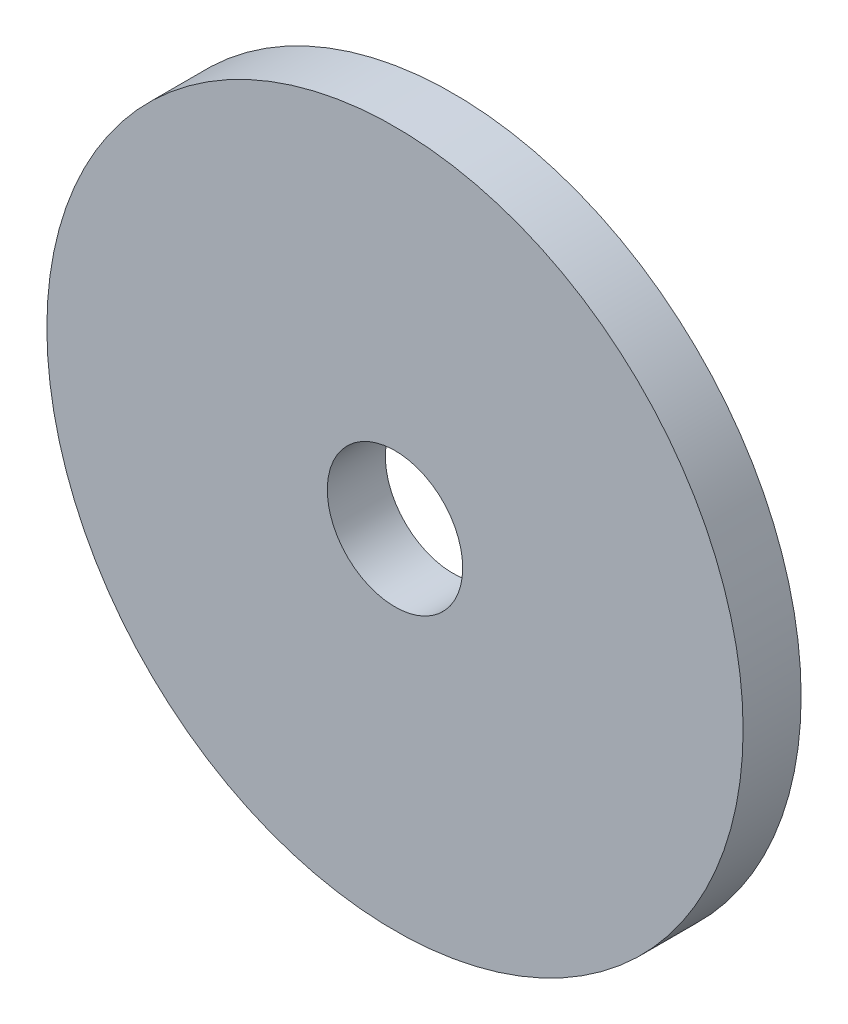
ISO-10303-21;
HEADER;
FILE_DESCRIPTION(('STEP AP214'),'2;1');
FILE_NAME('part.step','',(''),(''),'','','');
FILE_SCHEMA(('AUTOMOTIVE_DESIGN { 1 0 10303 214 1 1 1 1 }'));
ENDSEC;
DATA;
#1=APPLICATION_CONTEXT('core data for automotive mechanical design processes');
#2=APPLICATION_PROTOCOL_DEFINITION('international standard','automotive_design',2000,#1);
#3=PRODUCT_CONTEXT('',#1,'mechanical');
#4=PRODUCT('Part','Part','',(#3));
#5=PRODUCT_RELATED_PRODUCT_CATEGORY('part','',(#4));
#6=PRODUCT_DEFINITION_FORMATION('','',#4);
#7=PRODUCT_DEFINITION_CONTEXT('part definition',#1,'design');
#8=PRODUCT_DEFINITION('design','',#6,#7);
#9=PRODUCT_DEFINITION_SHAPE('','',#8);
#10=(LENGTH_UNIT() NAMED_UNIT(*) SI_UNIT(.MILLI.,.METRE.));
#11=(NAMED_UNIT(*) PLANE_ANGLE_UNIT() SI_UNIT($,.RADIAN.));
#12=(NAMED_UNIT(*) SI_UNIT($,.STERADIAN.) SOLID_ANGLE_UNIT());
#13=UNCERTAINTY_MEASURE_WITH_UNIT(LENGTH_MEASURE(1.E-05),#10,'distance_accuracy_value','');
#14=(GEOMETRIC_REPRESENTATION_CONTEXT(3) GLOBAL_UNCERTAINTY_ASSIGNED_CONTEXT((#13)) GLOBAL_UNIT_ASSIGNED_CONTEXT((#10,
#11,#12)) REPRESENTATION_CONTEXT('',''));
#15=CARTESIAN_POINT('',(0.,0.,0.));
#16=DIRECTION('',(0.,0.,1.));
#17=DIRECTION('',(1.,0.,0.));
#18=AXIS2_PLACEMENT_3D('',#15,#16,#17);
#19=CARTESIAN_POINT('',(0.,0.,38.1));
#20=DIRECTION('',(0.,0.,-1.));
#21=DIRECTION('',(-1.,0.,0.));
#22=AXIS2_PLACEMENT_3D('',#19,#20,#21);
#23=CYLINDRICAL_SURFACE('',#22,228.6);
#24=CARTESIAN_POINT('',(0.,0.,38.1));
#25=DIRECTION('',(0.,0.,1.));
#26=DIRECTION('',(1.,0.,0.));
#27=AXIS2_PLACEMENT_3D('',#24,#25,#26);
#28=CIRCLE('',#27,228.6);
#29=CARTESIAN_POINT('',(-228.6,0.,38.1));
#30=VERTEX_POINT('',#29);
#31=EDGE_CURVE('E10',#30,#30,#28,.T.);
#32=CARTESIAN_POINT('',(0.,0.,0.));
#33=DIRECTION('',(0.,0.,1.));
#34=DIRECTION('',(1.,0.,0.));
#35=AXIS2_PLACEMENT_3D('',#32,#33,#34);
#36=CIRCLE('',#35,228.6);
#37=CARTESIAN_POINT('',(-228.6,0.,0.));
#38=VERTEX_POINT('',#37);
#39=EDGE_CURVE('E34',#38,#38,#36,.T.);
#40=CARTESIAN_POINT('',(-228.6,0.,38.1));
#41=CARTESIAN_POINT('',(-228.6,0.,37.703125));
#42=CARTESIAN_POINT('',(-228.6,0.,37.30625));
#43=CARTESIAN_POINT('',(-228.6,0.,36.5125));
#44=CARTESIAN_POINT('',(-228.6,0.,36.115625));
#45=CARTESIAN_POINT('',(-228.6,0.,35.321875));
#46=CARTESIAN_POINT('',(-228.6,0.,34.925));
#47=CARTESIAN_POINT('',(-228.6,0.,34.13125));
#48=CARTESIAN_POINT('',(-228.6,0.,33.734375));
#49=CARTESIAN_POINT('',(-228.6,0.,32.940625));
#50=CARTESIAN_POINT('',(-228.6,0.,32.54375));
#51=CARTESIAN_POINT('',(-228.6,0.,31.75));
#52=CARTESIAN_POINT('',(-228.6,0.,31.353125));
#53=CARTESIAN_POINT('',(-228.6,0.,30.559375));
#54=CARTESIAN_POINT('',(-228.6,0.,30.1625));
#55=CARTESIAN_POINT('',(-228.6,0.,29.36875));
#56=CARTESIAN_POINT('',(-228.6,0.,28.971875));
#57=CARTESIAN_POINT('',(-228.6,0.,28.178125));
#58=CARTESIAN_POINT('',(-228.6,0.,27.78125));
#59=CARTESIAN_POINT('',(-228.6,0.,26.9875));
#60=CARTESIAN_POINT('',(-228.6,0.,26.590625));
#61=CARTESIAN_POINT('',(-228.6,0.,25.796875));
#62=CARTESIAN_POINT('',(-228.6,0.,25.4));
#63=CARTESIAN_POINT('',(-228.6,0.,24.60625));
#64=CARTESIAN_POINT('',(-228.6,0.,24.209375));
#65=CARTESIAN_POINT('',(-228.6,0.,23.415625));
#66=CARTESIAN_POINT('',(-228.6,0.,23.01875));
#67=CARTESIAN_POINT('',(-228.6,0.,22.225));
#68=CARTESIAN_POINT('',(-228.6,0.,21.828125));
#69=CARTESIAN_POINT('',(-228.6,0.,21.034375));
#70=CARTESIAN_POINT('',(-228.6,0.,20.6375));
#71=CARTESIAN_POINT('',(-228.6,0.,19.84375));
#72=CARTESIAN_POINT('',(-228.6,0.,19.446875));
#73=CARTESIAN_POINT('',(-228.6,0.,18.653125));
#74=CARTESIAN_POINT('',(-228.6,0.,18.25625));
#75=CARTESIAN_POINT('',(-228.6,0.,17.4625));
#76=CARTESIAN_POINT('',(-228.6,0.,17.065625));
#77=CARTESIAN_POINT('',(-228.6,0.,16.271875));
#78=CARTESIAN_POINT('',(-228.6,0.,15.875));
#79=CARTESIAN_POINT('',(-228.6,0.,15.08125));
#80=CARTESIAN_POINT('',(-228.6,0.,14.684375));
#81=CARTESIAN_POINT('',(-228.6,0.,13.890625));
#82=CARTESIAN_POINT('',(-228.6,0.,13.49375));
#83=CARTESIAN_POINT('',(-228.6,0.,12.7));
#84=CARTESIAN_POINT('',(-228.6,0.,12.303125));
#85=CARTESIAN_POINT('',(-228.6,0.,11.509375));
#86=CARTESIAN_POINT('',(-228.6,0.,11.1125));
#87=CARTESIAN_POINT('',(-228.6,0.,10.31875));
#88=CARTESIAN_POINT('',(-228.6,0.,9.92187499999999));
#89=CARTESIAN_POINT('',(-228.6,0.,9.128125));
#90=CARTESIAN_POINT('',(-228.6,0.,8.73124999999999));
#91=CARTESIAN_POINT('',(-228.6,0.,7.93749999999999));
#92=CARTESIAN_POINT('',(-228.6,0.,7.54062499999999));
#93=CARTESIAN_POINT('',(-228.6,0.,6.746875));
#94=CARTESIAN_POINT('',(-228.6,0.,6.35));
#95=CARTESIAN_POINT('',(-228.6,0.,5.55625));
#96=CARTESIAN_POINT('',(-228.6,0.,5.159375));
#97=CARTESIAN_POINT('',(-228.6,0.,4.365625));
#98=CARTESIAN_POINT('',(-228.6,0.,3.96875));
#99=CARTESIAN_POINT('',(-228.6,0.,3.175));
#100=CARTESIAN_POINT('',(-228.6,0.,2.778125));
#101=CARTESIAN_POINT('',(-228.6,0.,1.984375));
#102=CARTESIAN_POINT('',(-228.6,0.,1.5875));
#103=CARTESIAN_POINT('',(-228.6,0.,0.79375));
#104=CARTESIAN_POINT('',(-228.6,0.,0.396875));
#105=CARTESIAN_POINT('',(-228.6,0.,0.));
#106=B_SPLINE_CURVE_WITH_KNOTS('',3,(#40,#41,#42,#43,#44,#45,#46,#47,#48,#49,#50,#51,#52,#53,
#54,#55,#56,#57,#58,#59,#60,#61,#62,#63,#64,#65,#66,#67,#68,#69,#70,#71,#72,#73,#74,#75,#76,#77,
#78,#79,#80,#81,#82,#83,#84,#85,#86,#87,#88,#89,#90,#91,#92,#93,#94,#95,#96,#97,#98,#99,#100,
#101,#102,#103,#104,#105),.UNSPECIFIED.,.F.,.F.,(4,2,2,2,2,2,2,2,2,2,2,2,2,2,2,2,2,2,2,2,2,2,2,
2,2,2,2,2,2,2,2,2,4),(0.,1.190625,2.38125,3.571875,4.7625,5.953125,7.14375,8.334375,
9.52500000000001,10.715625,11.90625,13.096875,14.2875,15.478125,16.66875,17.859375,19.05,
20.240625,21.43125,22.621875,23.8125,25.003125,26.19375,27.384375,28.575,29.765625,30.95625,
32.146875,33.3375,34.528125,35.71875,36.909375,38.1),.UNSPECIFIED.);
#107=EDGE_CURVE('BSEAM31',#30,#38,#106,.T.);
#108=ORIENTED_EDGE('',*,*,#31,.F.);
#109=ORIENTED_EDGE('',*,*,#39,.T.);
#110=ORIENTED_EDGE('',*,*,#107,.T.);
#111=ORIENTED_EDGE('',*,*,#107,.F.);
#112=EDGE_LOOP('',(#108,#110,#109,#111));
#113=FACE_BOUND('',#112,.T.);
#114=ADVANCED_FACE('F31',(#113),#23,.T.);
#115=CARTESIAN_POINT('',(0.,0.,38.1));
#116=DIRECTION('',(0.,0.,1.));
#117=DIRECTION('',(1.,0.,0.));
#118=AXIS2_PLACEMENT_3D('',#115,#116,#117);
#119=PLANE('',#118);
#120=CARTESIAN_POINT('',(0.,0.,38.1));
#121=DIRECTION('',(0.,0.,1.));
#122=DIRECTION('',(1.,0.,0.));
#123=AXIS2_PLACEMENT_3D('',#120,#121,#122);
#124=CIRCLE('',#123,44.45);
#125=CARTESIAN_POINT('',(44.45,0.,38.1));
#126=VERTEX_POINT('',#125);
#127=EDGE_CURVE('E43',#126,#126,#124,.T.);
#128=ORIENTED_EDGE('',*,*,#127,.F.);
#129=EDGE_LOOP('',(#128));
#130=FACE_BOUND('',#129,.T.);
#131=ORIENTED_EDGE('',*,*,#31,.T.);
#132=EDGE_LOOP('',(#131));
#133=FACE_BOUND('',#132,.T.);
#134=ADVANCED_FACE('F58',(#130,#133),#119,.T.);
#135=CARTESIAN_POINT('',(0.,0.,0.));
#136=DIRECTION('',(0.,0.,1.));
#137=DIRECTION('',(1.,0.,0.));
#138=AXIS2_PLACEMENT_3D('',#135,#136,#137);
#139=PLANE('',#138);
#140=CARTESIAN_POINT('',(0.,0.,0.));
#141=DIRECTION('',(0.,0.,1.));
#142=DIRECTION('',(1.,0.,0.));
#143=AXIS2_PLACEMENT_3D('',#140,#141,#142);
#144=CIRCLE('',#143,44.45);
#145=CARTESIAN_POINT('',(44.45,0.,0.));
#146=VERTEX_POINT('',#145);
#147=EDGE_CURVE('E41',#146,#146,#144,.T.);
#148=ORIENTED_EDGE('',*,*,#147,.T.);
#149=EDGE_LOOP('',(#148));
#150=FACE_BOUND('',#149,.T.);
#151=ORIENTED_EDGE('',*,*,#39,.F.);
#152=EDGE_LOOP('',(#151));
#153=FACE_BOUND('',#152,.T.);
#154=ADVANCED_FACE('F49',(#150,#153),#139,.F.);
#155=CARTESIAN_POINT('',(0.,0.,0.));
#156=DIRECTION('',(0.,0.,1.));
#157=DIRECTION('',(1.,0.,0.));
#158=AXIS2_PLACEMENT_3D('',#155,#156,#157);
#159=CYLINDRICAL_SURFACE('',#158,44.45);
#160=CARTESIAN_POINT('',(44.45,0.,0.));
#161=CARTESIAN_POINT('',(44.45,0.,0.396875));
#162=CARTESIAN_POINT('',(44.45,0.,0.79375));
#163=CARTESIAN_POINT('',(44.45,0.,1.5875));
#164=CARTESIAN_POINT('',(44.45,0.,1.984375));
#165=CARTESIAN_POINT('',(44.45,0.,2.778125));
#166=CARTESIAN_POINT('',(44.45,0.,3.175));
#167=CARTESIAN_POINT('',(44.45,0.,3.96875));
#168=CARTESIAN_POINT('',(44.45,0.,4.365625));
#169=CARTESIAN_POINT('',(44.45,0.,5.159375));
#170=CARTESIAN_POINT('',(44.45,0.,5.55625));
#171=CARTESIAN_POINT('',(44.45,0.,6.35));
#172=CARTESIAN_POINT('',(44.45,0.,6.746875));
#173=CARTESIAN_POINT('',(44.45,0.,7.540625));
#174=CARTESIAN_POINT('',(44.45,0.,7.9375));
#175=CARTESIAN_POINT('',(44.45,0.,8.73125));
#176=CARTESIAN_POINT('',(44.45,0.,9.128125));
#177=CARTESIAN_POINT('',(44.45,0.,9.921875));
#178=CARTESIAN_POINT('',(44.45,0.,10.31875));
#179=CARTESIAN_POINT('',(44.45,0.,11.1125));
#180=CARTESIAN_POINT('',(44.45,0.,11.509375));
#181=CARTESIAN_POINT('',(44.45,0.,12.303125));
#182=CARTESIAN_POINT('',(44.45,0.,12.7));
#183=CARTESIAN_POINT('',(44.45,0.,13.49375));
#184=CARTESIAN_POINT('',(44.45,0.,13.890625));
#185=CARTESIAN_POINT('',(44.45,0.,14.684375));
#186=CARTESIAN_POINT('',(44.45,0.,15.08125));
#187=CARTESIAN_POINT('',(44.45,0.,15.875));
#188=CARTESIAN_POINT('',(44.45,0.,16.271875));
#189=CARTESIAN_POINT('',(44.45,0.,17.065625));
#190=CARTESIAN_POINT('',(44.45,0.,17.4625));
#191=CARTESIAN_POINT('',(44.45,0.,18.25625));
#192=CARTESIAN_POINT('',(44.45,0.,18.653125));
#193=CARTESIAN_POINT('',(44.45,0.,19.446875));
#194=CARTESIAN_POINT('',(44.45,0.,19.84375));
#195=CARTESIAN_POINT('',(44.45,0.,20.6375));
#196=CARTESIAN_POINT('',(44.45,0.,21.034375));
#197=CARTESIAN_POINT('',(44.45,0.,21.828125));
#198=CARTESIAN_POINT('',(44.45,0.,22.225));
#199=CARTESIAN_POINT('',(44.45,0.,23.01875));
#200=CARTESIAN_POINT('',(44.45,0.,23.415625));
#201=CARTESIAN_POINT('',(44.45,0.,24.209375));
#202=CARTESIAN_POINT('',(44.45,0.,24.60625));
#203=CARTESIAN_POINT('',(44.45,0.,25.4));
#204=CARTESIAN_POINT('',(44.45,0.,25.796875));
#205=CARTESIAN_POINT('',(44.45,0.,26.590625));
#206=CARTESIAN_POINT('',(44.45,0.,26.9875));
#207=CARTESIAN_POINT('',(44.45,0.,27.78125));
#208=CARTESIAN_POINT('',(44.45,0.,28.178125));
#209=CARTESIAN_POINT('',(44.45,0.,28.971875));
#210=CARTESIAN_POINT('',(44.45,0.,29.36875));
#211=CARTESIAN_POINT('',(44.45,0.,30.1625));
#212=CARTESIAN_POINT('',(44.45,0.,30.559375));
#213=CARTESIAN_POINT('',(44.45,0.,31.353125));
#214=CARTESIAN_POINT('',(44.45,0.,31.75));
#215=CARTESIAN_POINT('',(44.45,0.,32.54375));
#216=CARTESIAN_POINT('',(44.45,0.,32.940625));
#217=CARTESIAN_POINT('',(44.45,0.,33.734375));
#218=CARTESIAN_POINT('',(44.45,0.,34.13125));
#219=CARTESIAN_POINT('',(44.45,0.,34.925));
#220=CARTESIAN_POINT('',(44.45,0.,35.321875));
#221=CARTESIAN_POINT('',(44.45,0.,36.115625));
#222=CARTESIAN_POINT('',(44.45,0.,36.5125));
#223=CARTESIAN_POINT('',(44.45,0.,37.30625));
#224=CARTESIAN_POINT('',(44.45,0.,37.703125));
#225=CARTESIAN_POINT('',(44.45,0.,38.1));
#226=B_SPLINE_CURVE_WITH_KNOTS('',3,(#160,#161,#162,#163,#164,#165,#166,#167,#168,#169,#170,
#171,#172,#173,#174,#175,#176,#177,#178,#179,#180,#181,#182,#183,#184,#185,#186,#187,#188,#189,
#190,#191,#192,#193,#194,#195,#196,#197,#198,#199,#200,#201,#202,#203,#204,#205,#206,#207,#208,
#209,#210,#211,#212,#213,#214,#215,#216,#217,#218,#219,#220,#221,#222,#223,#224,#225),
.UNSPECIFIED.,.F.,.F.,(4,2,2,2,2,2,2,2,2,2,2,2,2,2,2,2,2,2,2,2,2,2,2,2,2,2,2,2,2,2,2,2,4),(0.,
1.190625,2.38125,3.571875,4.7625,5.953125,7.14375,8.334375,9.525,10.715625,11.90625,13.096875,
14.2875,15.478125,16.66875,17.859375,19.05,20.240625,21.43125,22.621875,23.8125,25.003125,
26.19375,27.384375,28.575,29.765625,30.95625,32.146875,33.3375,34.528125,35.71875,36.909375,
38.1),.UNSPECIFIED.);
#227=EDGE_CURVE('BSEAM52',#146,#126,#226,.T.);
#228=ORIENTED_EDGE('',*,*,#147,.F.);
#229=ORIENTED_EDGE('',*,*,#127,.T.);
#230=ORIENTED_EDGE('',*,*,#227,.T.);
#231=ORIENTED_EDGE('',*,*,#227,.F.);
#232=EDGE_LOOP('',(#228,#230,#229,#231));
#233=FACE_BOUND('',#232,.T.);
#234=ADVANCED_FACE('F52',(#233),#159,.F.);
#235=CLOSED_SHELL('',(#114,#134,#154,#234));
#236=MANIFOLD_SOLID_BREP('B2',#235);
#237=ADVANCED_BREP_SHAPE_REPRESENTATION('',(#18,#236),#14);
#238=SHAPE_DEFINITION_REPRESENTATION(#9,#237);
ENDSEC;
END-ISO-10303-21;
